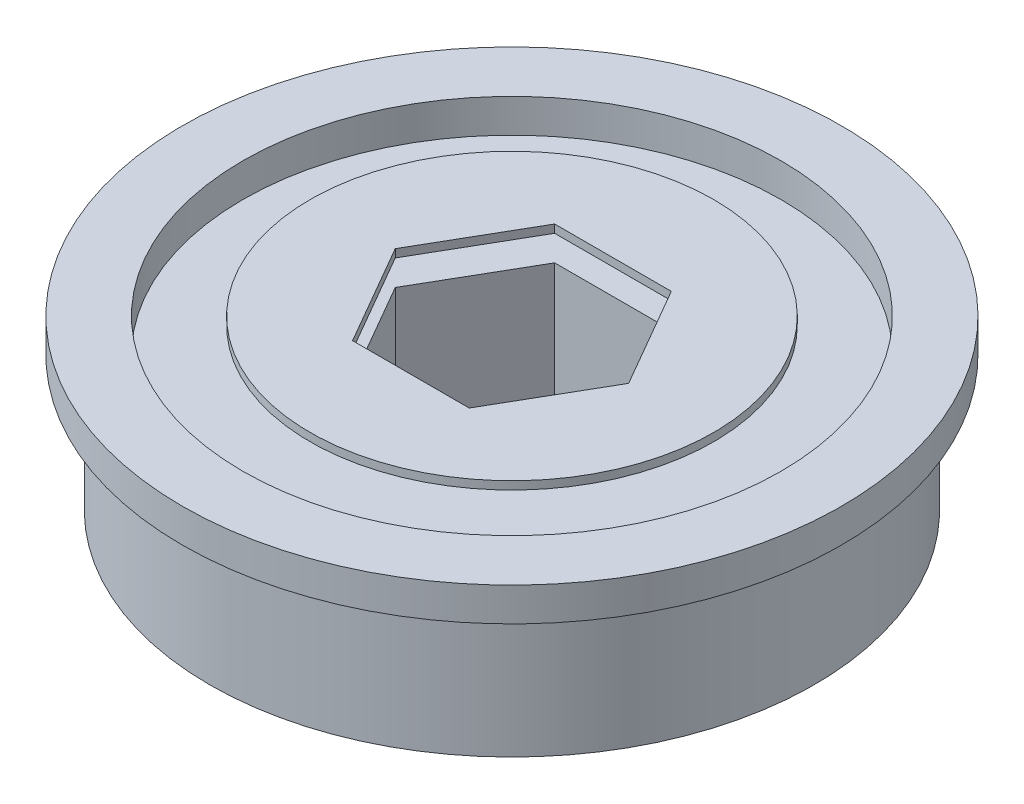
ISO-10303-21;
HEADER;
FILE_DESCRIPTION(('STEP AP214'),'2;1');
FILE_NAME('part.step','',(''),(''),'','','');
FILE_SCHEMA(('AUTOMOTIVE_DESIGN { 1 0 10303 214 1 1 1 1 }'));
ENDSEC;
DATA;
#1=APPLICATION_CONTEXT('core data for automotive mechanical design processes');
#2=APPLICATION_PROTOCOL_DEFINITION('international standard','automotive_design',2000,#1);
#3=PRODUCT_CONTEXT('',#1,'mechanical');
#4=PRODUCT('Part','Part','',(#3));
#5=PRODUCT_RELATED_PRODUCT_CATEGORY('part','',(#4));
#6=PRODUCT_DEFINITION_FORMATION('','',#4);
#7=PRODUCT_DEFINITION_CONTEXT('part definition',#1,'design');
#8=PRODUCT_DEFINITION('design','',#6,#7);
#9=PRODUCT_DEFINITION_SHAPE('','',#8);
#10=(LENGTH_UNIT() NAMED_UNIT(*) SI_UNIT(.MILLI.,.METRE.));
#11=(NAMED_UNIT(*) PLANE_ANGLE_UNIT() SI_UNIT($,.RADIAN.));
#12=(NAMED_UNIT(*) SI_UNIT($,.STERADIAN.) SOLID_ANGLE_UNIT());
#13=UNCERTAINTY_MEASURE_WITH_UNIT(LENGTH_MEASURE(1.E-05),#10,'distance_accuracy_value','');
#14=(GEOMETRIC_REPRESENTATION_CONTEXT(3) GLOBAL_UNCERTAINTY_ASSIGNED_CONTEXT((#13)) GLOBAL_UNIT_ASSIGNED_CONTEXT((#10,
#11,#12)) REPRESENTATION_CONTEXT('',''));
#15=CARTESIAN_POINT('',(0.,0.,0.));
#16=DIRECTION('',(0.,0.,1.));
#17=DIRECTION('',(1.,0.,0.));
#18=AXIS2_PLACEMENT_3D('',#15,#16,#17);
#19=CARTESIAN_POINT('',(0.,7.9375,0.));
#20=DIRECTION('',(0.,1.,0.));
#21=DIRECTION('',(0.,0.,1.));
#22=AXIS2_PLACEMENT_3D('',#19,#20,#21);
#23=PLANE('',#22);
#24=CARTESIAN_POINT('',(0.,7.9375,0.));
#25=DIRECTION('',(0.,-1.,0.));
#26=DIRECTION('',(0.,0.,-1.));
#27=AXIS2_PLACEMENT_3D('',#24,#25,#26);
#28=CIRCLE('',#27,9.525);
#29=CARTESIAN_POINT('',(0.,7.9375,-9.525));
#30=VERTEX_POINT('',#29);
#31=EDGE_CURVE('P0_E20',#30,#30,#28,.T.);
#32=ORIENTED_EDGE('',*,*,#31,.F.);
#33=EDGE_LOOP('',(#32));
#34=FACE_BOUND('',#33,.T.);
#35=DIRECTION('',(0.5,0.,-0.866025403784439));
#36=VECTOR('',#35,1.);
#37=CARTESIAN_POINT('',(5.50792156806903,7.9375,0.));
#38=LINE('',#37,#36);
#39=CARTESIAN_POINT('',(5.50792156806903,7.9375,0.));
#40=VERTEX_POINT('',#39);
#41=CARTESIAN_POINT('',(2.75396078403451,7.9375,4.77));
#42=VERTEX_POINT('',#41);
#43=EDGE_CURVE('P0_E91',#40,#42,#38,.F.);
#44=ORIENTED_EDGE('',*,*,#43,.T.);
#45=DIRECTION('',(1.,0.,0.));
#46=VECTOR('',#45,1.);
#47=CARTESIAN_POINT('',(2.75396078403451,7.9375,4.77));
#48=LINE('',#47,#46);
#49=CARTESIAN_POINT('',(-2.75396078403451,7.9375,4.77));
#50=VERTEX_POINT('',#49);
#51=EDGE_CURVE('P0_E96',#42,#50,#48,.F.);
#52=ORIENTED_EDGE('',*,*,#51,.T.);
#53=DIRECTION('',(0.5,0.,0.866025403784439));
#54=VECTOR('',#53,1.);
#55=CARTESIAN_POINT('',(-2.75396078403451,7.9375,4.77));
#56=LINE('',#55,#54);
#57=CARTESIAN_POINT('',(-5.50792156806903,7.9375,0.));
#58=VERTEX_POINT('',#57);
#59=EDGE_CURVE('P0_E101',#50,#58,#56,.F.);
#60=ORIENTED_EDGE('',*,*,#59,.T.);
#61=DIRECTION('',(-0.5,0.,0.866025403784439));
#62=VECTOR('',#61,1.);
#63=CARTESIAN_POINT('',(-5.50792156806903,7.9375,0.));
#64=LINE('',#63,#62);
#65=CARTESIAN_POINT('',(-2.75396078403451,7.9375,-4.77));
#66=VERTEX_POINT('',#65);
#67=EDGE_CURVE('P0_E71',#58,#66,#64,.F.);
#68=ORIENTED_EDGE('',*,*,#67,.T.);
#69=DIRECTION('',(-1.,0.,0.));
#70=VECTOR('',#69,1.);
#71=CARTESIAN_POINT('',(-2.75396078403451,7.9375,-4.77));
#72=LINE('',#71,#70);
#73=CARTESIAN_POINT('',(2.75396078403451,7.9375,-4.77));
#74=VERTEX_POINT('',#73);
#75=EDGE_CURVE('P0_E70',#66,#74,#72,.F.);
#76=ORIENTED_EDGE('',*,*,#75,.T.);
#77=DIRECTION('',(-0.5,0.,-0.866025403784439));
#78=VECTOR('',#77,1.);
#79=CARTESIAN_POINT('',(2.75396078403452,7.9375,-4.77));
#80=LINE('',#79,#78);
#81=EDGE_CURVE('P0_E67',#74,#40,#80,.F.);
#82=ORIENTED_EDGE('',*,*,#81,.T.);
#83=EDGE_LOOP('',(#44,#52,#60,#68,#76,#82));
#84=FACE_BOUND('',#83,.T.);
#85=ADVANCED_FACE('P0_F17',(#34,#84),#23,.T.);
#86=CARTESIAN_POINT('',(-2.75396078403451,7.9375,-4.77));
#87=DIRECTION('',(0.,0.,-1.));
#88=DIRECTION('',(-1.,0.,0.));
#89=AXIS2_PLACEMENT_3D('',#86,#87,#88);
#90=PLANE('',#89);
#91=ORIENTED_EDGE('',*,*,#75,.F.);
#92=DIRECTION('',(0.,1.,0.));
#93=VECTOR('',#92,1.);
#94=CARTESIAN_POINT('',(-2.75396078403451,7.9375,-4.77));
#95=LINE('',#94,#93);
#96=CARTESIAN_POINT('',(-2.75396078403451,7.5565,-4.77));
#97=VERTEX_POINT('',#96);
#98=EDGE_CURVE('P0_E105',#66,#97,#95,.F.);
#99=ORIENTED_EDGE('',*,*,#98,.T.);
#100=DIRECTION('',(1.,0.,0.));
#101=VECTOR('',#100,1.);
#102=CARTESIAN_POINT('',(0.,7.5565,-4.77));
#103=LINE('',#102,#101);
#104=CARTESIAN_POINT('',(2.75396078403451,7.5565,-4.77));
#105=VERTEX_POINT('',#104);
#106=EDGE_CURVE('P0_E87',#97,#105,#103,.T.);
#107=ORIENTED_EDGE('',*,*,#106,.T.);
#108=DIRECTION('',(0.,1.,0.));
#109=VECTOR('',#108,1.);
#110=CARTESIAN_POINT('',(2.75396078403452,7.9375,-4.77));
#111=LINE('',#110,#109);
#112=EDGE_CURVE('P0_E76',#105,#74,#111,.T.);
#113=ORIENTED_EDGE('',*,*,#112,.T.);
#114=EDGE_LOOP('',(#91,#99,#107,#113));
#115=FACE_BOUND('',#114,.T.);
#116=ADVANCED_FACE('P0_F86',(#115),#90,.F.);
#117=CARTESIAN_POINT('',(2.75396078403452,7.9375,-4.77));
#118=DIRECTION('',(0.866025403784439,0.,-0.5));
#119=DIRECTION('',(-0.5,0.,-0.866025403784439));
#120=AXIS2_PLACEMENT_3D('',#117,#118,#119);
#121=PLANE('',#120);
#122=ORIENTED_EDGE('',*,*,#81,.F.);
#123=ORIENTED_EDGE('',*,*,#112,.F.);
#124=DIRECTION('',(0.5,0.,0.866025403784439));
#125=VECTOR('',#124,1.);
#126=CARTESIAN_POINT('',(2.75396078403452,7.5565,-4.77));
#127=LINE('',#126,#125);
#128=CARTESIAN_POINT('',(5.50792156806903,7.5565,0.));
#129=VERTEX_POINT('',#128);
#130=EDGE_CURVE('P0_E108',#105,#129,#127,.T.);
#131=ORIENTED_EDGE('',*,*,#130,.T.);
#132=DIRECTION('',(0.,1.,0.));
#133=VECTOR('',#132,1.);
#134=CARTESIAN_POINT('',(5.50792156806903,7.9375,0.));
#135=LINE('',#134,#133);
#136=EDGE_CURVE('P0_E83',#129,#40,#135,.T.);
#137=ORIENTED_EDGE('',*,*,#136,.T.);
#138=EDGE_LOOP('',(#122,#123,#131,#137));
#139=FACE_BOUND('',#138,.T.);
#140=ADVANCED_FACE('P0_F80',(#139),#121,.F.);
#141=CARTESIAN_POINT('',(5.50792156806903,7.9375,0.));
#142=DIRECTION('',(0.866025403784439,0.,0.5));
#143=DIRECTION('',(0.5,0.,-0.866025403784439));
#144=AXIS2_PLACEMENT_3D('',#141,#142,#143);
#145=PLANE('',#144);
#146=ORIENTED_EDGE('',*,*,#43,.F.);
#147=ORIENTED_EDGE('',*,*,#136,.F.);
#148=DIRECTION('',(-0.5,0.,0.866025403784439));
#149=VECTOR('',#148,1.);
#150=CARTESIAN_POINT('',(5.50792156806903,7.5565,0.));
#151=LINE('',#150,#149);
#152=CARTESIAN_POINT('',(2.75396078403451,7.5565,4.77));
#153=VERTEX_POINT('',#152);
#154=EDGE_CURVE('P0_E110',#129,#153,#151,.T.);
#155=ORIENTED_EDGE('',*,*,#154,.T.);
#156=DIRECTION('',(0.,1.,0.));
#157=VECTOR('',#156,1.);
#158=CARTESIAN_POINT('',(2.75396078403451,7.9375,4.77));
#159=LINE('',#158,#157);
#160=EDGE_CURVE('P0_E93',#153,#42,#159,.T.);
#161=ORIENTED_EDGE('',*,*,#160,.T.);
#162=EDGE_LOOP('',(#146,#147,#155,#161));
#163=FACE_BOUND('',#162,.T.);
#164=ADVANCED_FACE('P0_F132',(#163),#145,.F.);
#165=CARTESIAN_POINT('',(2.75396078403451,7.9375,4.77));
#166=DIRECTION('',(0.,0.,1.));
#167=DIRECTION('',(1.,0.,0.));
#168=AXIS2_PLACEMENT_3D('',#165,#166,#167);
#169=PLANE('',#168);
#170=ORIENTED_EDGE('',*,*,#51,.F.);
#171=ORIENTED_EDGE('',*,*,#160,.F.);
#172=DIRECTION('',(1.,0.,0.));
#173=VECTOR('',#172,1.);
#174=CARTESIAN_POINT('',(0.,7.5565,4.77));
#175=LINE('',#174,#173);
#176=CARTESIAN_POINT('',(-2.75396078403451,7.5565,4.77));
#177=VERTEX_POINT('',#176);
#178=EDGE_CURVE('P0_E113',#153,#177,#175,.F.);
#179=ORIENTED_EDGE('',*,*,#178,.T.);
#180=DIRECTION('',(0.,1.,0.));
#181=VECTOR('',#180,1.);
#182=CARTESIAN_POINT('',(-2.75396078403451,7.9375,4.77));
#183=LINE('',#182,#181);
#184=EDGE_CURVE('P0_E98',#177,#50,#183,.T.);
#185=ORIENTED_EDGE('',*,*,#184,.T.);
#186=EDGE_LOOP('',(#170,#171,#179,#185));
#187=FACE_BOUND('',#186,.T.);
#188=ADVANCED_FACE('P0_F129',(#187),#169,.F.);
#189=CARTESIAN_POINT('',(-2.75396078403451,7.9375,4.77));
#190=DIRECTION('',(-0.866025403784439,0.,0.5));
#191=DIRECTION('',(0.5,0.,0.866025403784439));
#192=AXIS2_PLACEMENT_3D('',#189,#190,#191);
#193=PLANE('',#192);
#194=ORIENTED_EDGE('',*,*,#59,.F.);
#195=ORIENTED_EDGE('',*,*,#184,.F.);
#196=DIRECTION('',(-0.5,0.,-0.866025403784439));
#197=VECTOR('',#196,1.);
#198=CARTESIAN_POINT('',(-2.75396078403451,7.5565,4.77));
#199=LINE('',#198,#197);
#200=CARTESIAN_POINT('',(-5.50792156806903,7.5565,0.));
#201=VERTEX_POINT('',#200);
#202=EDGE_CURVE('P0_E116',#177,#201,#199,.T.);
#203=ORIENTED_EDGE('',*,*,#202,.T.);
#204=DIRECTION('',(0.,1.,0.));
#205=VECTOR('',#204,1.);
#206=CARTESIAN_POINT('',(-5.50792156806903,7.9375,0.));
#207=LINE('',#206,#205);
#208=EDGE_CURVE('P0_E34',#201,#58,#207,.T.);
#209=ORIENTED_EDGE('',*,*,#208,.T.);
#210=EDGE_LOOP('',(#194,#195,#203,#209));
#211=FACE_BOUND('',#210,.T.);
#212=ADVANCED_FACE('P0_F126',(#211),#193,.F.);
#213=CARTESIAN_POINT('',(-5.50792156806903,7.9375,0.));
#214=DIRECTION('',(-0.866025403784439,0.,-0.5));
#215=DIRECTION('',(-0.5,0.,0.866025403784439));
#216=AXIS2_PLACEMENT_3D('',#213,#214,#215);
#217=PLANE('',#216);
#218=ORIENTED_EDGE('',*,*,#67,.F.);
#219=ORIENTED_EDGE('',*,*,#208,.F.);
#220=DIRECTION('',(0.500000000000001,0.,-0.866025403784438));
#221=VECTOR('',#220,1.);
#222=CARTESIAN_POINT('',(-5.50792156806903,7.5565,0.));
#223=LINE('',#222,#221);
#224=EDGE_CURVE('P0_E26',#201,#97,#223,.T.);
#225=ORIENTED_EDGE('',*,*,#224,.T.);
#226=ORIENTED_EDGE('',*,*,#98,.F.);
#227=EDGE_LOOP('',(#218,#219,#225,#226));
#228=FACE_BOUND('',#227,.T.);
#229=ADVANCED_FACE('P0_F119',(#228),#217,.F.);
#230=CARTESIAN_POINT('',(0.,7.9375,0.));
#231=DIRECTION('',(0.,-1.,0.));
#232=DIRECTION('',(0.,0.,-1.));
#233=AXIS2_PLACEMENT_3D('',#230,#231,#232);
#234=CYLINDRICAL_SURFACE('',#233,9.525);
#235=CARTESIAN_POINT('',(0.,7.5565,0.));
#236=DIRECTION('',(0.,-1.,0.));
#237=DIRECTION('',(0.,0.,-1.));
#238=AXIS2_PLACEMENT_3D('',#235,#236,#237);
#239=CIRCLE('',#238,9.525);
#240=CARTESIAN_POINT('',(0.,7.5565,-9.525));
#241=VERTEX_POINT('',#240);
#242=EDGE_CURVE('P0_E11',#241,#241,#239,.F.);
#243=ORIENTED_EDGE('',*,*,#242,.T.);
#244=EDGE_LOOP('',(#243));
#245=FACE_BOUND('',#244,.T.);
#246=ORIENTED_EDGE('',*,*,#31,.T.);
#247=EDGE_LOOP('',(#246));
#248=FACE_BOUND('',#247,.T.);
#249=ADVANCED_FACE('P0_F143',(#245,#248),#234,.T.);
#250=CARTESIAN_POINT('',(0.,7.5565,0.));
#251=DIRECTION('',(0.,1.,0.));
#252=DIRECTION('',(0.,0.,1.));
#253=AXIS2_PLACEMENT_3D('',#250,#251,#252);
#254=PLANE('',#253);
#255=ORIENTED_EDGE('',*,*,#242,.F.);
#256=EDGE_LOOP('',(#255));
#257=FACE_BOUND('',#256,.T.);
#258=ORIENTED_EDGE('',*,*,#202,.F.);
#259=ORIENTED_EDGE('',*,*,#178,.F.);
#260=ORIENTED_EDGE('',*,*,#154,.F.);
#261=ORIENTED_EDGE('',*,*,#130,.F.);
#262=ORIENTED_EDGE('',*,*,#106,.F.);
#263=ORIENTED_EDGE('',*,*,#224,.F.);
#264=EDGE_LOOP('',(#258,#259,#260,#261,#262,#263));
#265=FACE_BOUND('',#264,.T.);
#266=ADVANCED_FACE('P0_F122',(#257,#265),#254,.F.);
#267=CLOSED_SHELL('',(#85,#116,#140,#164,#188,#212,#229,#249,#266));
#268=MANIFOLD_SOLID_BREP('P0_B1',#267);
#269=CARTESIAN_POINT('',(0.,7.9375,0.));
#270=DIRECTION('',(0.,1.,0.));
#271=DIRECTION('',(0.,0.,1.));
#272=AXIS2_PLACEMENT_3D('',#269,#270,#271);
#273=PLANE('',#272);
#274=CARTESIAN_POINT('',(0.,7.9375,0.));
#275=DIRECTION('',(0.,1.,0.));
#276=DIRECTION('',(0.,0.,1.));
#277=AXIS2_PLACEMENT_3D('',#274,#275,#276);
#278=CIRCLE('',#277,15.5575);
#279=CARTESIAN_POINT('',(0.,7.9375,15.5575));
#280=VERTEX_POINT('',#279);
#281=EDGE_CURVE('P1_E105',#280,#280,#278,.F.);
#282=ORIENTED_EDGE('',*,*,#281,.F.);
#283=EDGE_LOOP('',(#282));
#284=FACE_BOUND('',#283,.T.);
#285=CARTESIAN_POINT('',(0.,7.9375,0.));
#286=DIRECTION('',(0.,1.,0.));
#287=DIRECTION('',(0.,0.,1.));
#288=AXIS2_PLACEMENT_3D('',#285,#286,#287);
#289=CIRCLE('',#288,12.7);
#290=CARTESIAN_POINT('',(0.,7.9375,12.7));
#291=VERTEX_POINT('',#290);
#292=EDGE_CURVE('P1_E20',#291,#291,#289,.F.);
#293=ORIENTED_EDGE('',*,*,#292,.T.);
#294=EDGE_LOOP('',(#293));
#295=FACE_BOUND('',#294,.T.);
#296=ADVANCED_FACE('P1_F17',(#284,#295),#273,.T.);
#297=CARTESIAN_POINT('',(0.,7.9375,0.));
#298=DIRECTION('',(0.,1.,0.));
#299=DIRECTION('',(0.,0.,1.));
#300=AXIS2_PLACEMENT_3D('',#297,#298,#299);
#301=CYLINDRICAL_SURFACE('',#300,12.7);
#302=CARTESIAN_POINT('',(0.,6.34999999999999,0.));
#303=DIRECTION('',(0.,1.,0.));
#304=DIRECTION('',(0.,0.,1.));
#305=AXIS2_PLACEMENT_3D('',#302,#303,#304);
#306=CIRCLE('',#305,12.7);
#307=CARTESIAN_POINT('',(0.,6.34999999999999,12.7));
#308=VERTEX_POINT('',#307);
#309=EDGE_CURVE('P1_E103',#308,#308,#306,.F.);
#310=ORIENTED_EDGE('',*,*,#309,.T.);
#311=EDGE_LOOP('',(#310));
#312=FACE_BOUND('',#311,.T.);
#313=ORIENTED_EDGE('',*,*,#292,.F.);
#314=EDGE_LOOP('',(#313));
#315=FACE_BOUND('',#314,.T.);
#316=ADVANCED_FACE('P1_F113',(#312,#315),#301,.F.);
#317=CARTESIAN_POINT('',(0.,6.35,0.));
#318=DIRECTION('',(0.,1.,0.));
#319=DIRECTION('',(0.,0.,1.));
#320=AXIS2_PLACEMENT_3D('',#317,#318,#319);
#321=CYLINDRICAL_SURFACE('',#320,15.5575);
#322=CARTESIAN_POINT('',(0.,6.35,0.));
#323=DIRECTION('',(0.,1.,0.));
#324=DIRECTION('',(0.,0.,1.));
#325=AXIS2_PLACEMENT_3D('',#322,#323,#324);
#326=CIRCLE('',#325,15.5575);
#327=CARTESIAN_POINT('',(0.,6.35,15.5575));
#328=VERTEX_POINT('',#327);
#329=EDGE_CURVE('P1_E86',#328,#328,#326,.F.);
#330=ORIENTED_EDGE('',*,*,#329,.F.);
#331=EDGE_LOOP('',(#330));
#332=FACE_BOUND('',#331,.T.);
#333=ORIENTED_EDGE('',*,*,#281,.T.);
#334=EDGE_LOOP('',(#333));
#335=FACE_BOUND('',#334,.T.);
#336=ADVANCED_FACE('P1_F115',(#332,#335),#321,.T.);
#337=CARTESIAN_POINT('',(0.,6.35,0.));
#338=DIRECTION('',(0.,-1.,0.));
#339=DIRECTION('',(0.,0.,-1.));
#340=AXIS2_PLACEMENT_3D('',#337,#338,#339);
#341=PLANE('',#340);
#342=ORIENTED_EDGE('',*,*,#309,.F.);
#343=EDGE_LOOP('',(#342));
#344=FACE_BOUND('',#343,.T.);
#345=DIRECTION('',(0.5,0.,0.866025403784439));
#346=VECTOR('',#345,1.);
#347=CARTESIAN_POINT('',(-2.75396078403451,6.35,4.77));
#348=LINE('',#347,#346);
#349=CARTESIAN_POINT('',(-2.75396078403451,6.35,4.77));
#350=VERTEX_POINT('',#349);
#351=CARTESIAN_POINT('',(-5.50792156806903,6.35,0.));
#352=VERTEX_POINT('',#351);
#353=EDGE_CURVE('P1_E73',#350,#352,#348,.F.);
#354=ORIENTED_EDGE('',*,*,#353,.T.);
#355=DIRECTION('',(-0.5,0.,0.866025403784439));
#356=VECTOR('',#355,1.);
#357=CARTESIAN_POINT('',(-5.50792156806903,6.35,0.));
#358=LINE('',#357,#356);
#359=CARTESIAN_POINT('',(-2.75396078403451,6.35,-4.77));
#360=VERTEX_POINT('',#359);
#361=EDGE_CURVE('P1_E266',#352,#360,#358,.F.);
#362=ORIENTED_EDGE('',*,*,#361,.T.);
#363=DIRECTION('',(-1.,0.,0.));
#364=VECTOR('',#363,1.);
#365=CARTESIAN_POINT('',(-2.75396078403451,6.35,-4.77));
#366=LINE('',#365,#364);
#367=CARTESIAN_POINT('',(2.75396078403451,6.35,-4.77));
#368=VERTEX_POINT('',#367);
#369=EDGE_CURVE('P1_E270',#360,#368,#366,.F.);
#370=ORIENTED_EDGE('',*,*,#369,.T.);
#371=DIRECTION('',(-0.5,0.,-0.866025403784439));
#372=VECTOR('',#371,1.);
#373=CARTESIAN_POINT('',(2.75396078403452,6.35,-4.77));
#374=LINE('',#373,#372);
#375=CARTESIAN_POINT('',(5.50792156806903,6.35,0.));
#376=VERTEX_POINT('',#375);
#377=EDGE_CURVE('P1_E273',#368,#376,#374,.F.);
#378=ORIENTED_EDGE('',*,*,#377,.T.);
#379=DIRECTION('',(0.5,0.,-0.866025403784439));
#380=VECTOR('',#379,1.);
#381=CARTESIAN_POINT('',(5.50792156806903,6.35,0.));
#382=LINE('',#381,#380);
#383=CARTESIAN_POINT('',(2.75396078403451,6.35,4.77));
#384=VERTEX_POINT('',#383);
#385=EDGE_CURVE('P1_E68',#376,#384,#382,.F.);
#386=ORIENTED_EDGE('',*,*,#385,.T.);
#387=DIRECTION('',(1.,0.,0.));
#388=VECTOR('',#387,1.);
#389=CARTESIAN_POINT('',(2.75396078403451,6.35,4.77));
#390=LINE('',#389,#388);
#391=EDGE_CURVE('P1_E70',#384,#350,#390,.F.);
#392=ORIENTED_EDGE('',*,*,#391,.T.);
#393=EDGE_LOOP('',(#354,#362,#370,#378,#386,#392));
#394=FACE_BOUND('',#393,.T.);
#395=ADVANCED_FACE('P1_F72',(#344,#394),#341,.F.);
#396=CARTESIAN_POINT('',(15.5575,6.35,0.));
#397=DIRECTION('',(0.,-1.,0.));
#398=DIRECTION('',(0.,0.,-1.));
#399=AXIS2_PLACEMENT_3D('',#396,#397,#398);
#400=PLANE('',#399);
#401=ORIENTED_EDGE('',*,*,#329,.T.);
#402=EDGE_LOOP('',(#401));
#403=FACE_BOUND('',#402,.T.);
#404=CARTESIAN_POINT('',(0.,6.35,0.));
#405=DIRECTION('',(0.,1.,0.));
#406=DIRECTION('',(0.,0.,1.));
#407=AXIS2_PLACEMENT_3D('',#404,#405,#406);
#408=CIRCLE('',#407,14.2748);
#409=CARTESIAN_POINT('',(0.,6.35,14.2748));
#410=VERTEX_POINT('',#409);
#411=EDGE_CURVE('P1_E97',#410,#410,#408,.F.);
#412=ORIENTED_EDGE('',*,*,#411,.F.);
#413=EDGE_LOOP('',(#412));
#414=FACE_BOUND('',#413,.T.);
#415=ADVANCED_FACE('P1_F156',(#403,#414),#400,.T.);
#416=CARTESIAN_POINT('',(-2.75396078403451,7.9375,4.77));
#417=DIRECTION('',(-0.866025403784439,0.,0.5));
#418=DIRECTION('',(0.5,0.,0.866025403784439));
#419=AXIS2_PLACEMENT_3D('',#416,#417,#418);
#420=PLANE('',#419);
#421=DIRECTION('',(0.5,0.,0.866025403784439));
#422=VECTOR('',#421,1.);
#423=CARTESIAN_POINT('',(-5.50792156806903,0.,0.));
#424=LINE('',#423,#422);
#425=CARTESIAN_POINT('',(-5.50792156806903,0.,0.));
#426=VERTEX_POINT('',#425);
#427=CARTESIAN_POINT('',(-2.75396078403451,0.,4.77));
#428=VERTEX_POINT('',#427);
#429=EDGE_CURVE('P1_E100',#426,#428,#424,.T.);
#430=ORIENTED_EDGE('',*,*,#429,.F.);
#431=DIRECTION('',(0.,1.,0.));
#432=VECTOR('',#431,1.);
#433=CARTESIAN_POINT('',(-5.50792156806903,7.9375,0.));
#434=LINE('',#433,#432);
#435=EDGE_CURVE('P1_E84',#426,#352,#434,.T.);
#436=ORIENTED_EDGE('',*,*,#435,.T.);
#437=ORIENTED_EDGE('',*,*,#353,.F.);
#438=DIRECTION('',(0.,1.,0.));
#439=VECTOR('',#438,1.);
#440=CARTESIAN_POINT('',(-2.75396078403451,7.9375,4.77));
#441=LINE('',#440,#439);
#442=EDGE_CURVE('P1_E78',#350,#428,#441,.F.);
#443=ORIENTED_EDGE('',*,*,#442,.T.);
#444=EDGE_LOOP('',(#430,#436,#437,#443));
#445=FACE_BOUND('',#444,.T.);
#446=ADVANCED_FACE('P1_F81',(#445),#420,.F.);
#447=CARTESIAN_POINT('',(2.75396078403451,7.9375,4.77));
#448=DIRECTION('',(0.,0.,1.));
#449=DIRECTION('',(1.,0.,0.));
#450=AXIS2_PLACEMENT_3D('',#447,#448,#449);
#451=PLANE('',#450);
#452=DIRECTION('',(1.,0.,0.));
#453=VECTOR('',#452,1.);
#454=CARTESIAN_POINT('',(0.,0.,4.77));
#455=LINE('',#454,#453);
#456=CARTESIAN_POINT('',(2.75396078403451,0.,4.77));
#457=VERTEX_POINT('',#456);
#458=EDGE_CURVE('P1_E90',#428,#457,#455,.T.);
#459=ORIENTED_EDGE('',*,*,#458,.F.);
#460=ORIENTED_EDGE('',*,*,#442,.F.);
#461=ORIENTED_EDGE('',*,*,#391,.F.);
#462=DIRECTION('',(0.,1.,0.));
#463=VECTOR('',#462,1.);
#464=CARTESIAN_POINT('',(2.75396078403451,7.9375,4.77));
#465=LINE('',#464,#463);
#466=EDGE_CURVE('P1_E93',#384,#457,#465,.F.);
#467=ORIENTED_EDGE('',*,*,#466,.T.);
#468=EDGE_LOOP('',(#459,#460,#461,#467));
#469=FACE_BOUND('',#468,.T.);
#470=ADVANCED_FACE('P1_F88',(#469),#451,.F.);
#471=CARTESIAN_POINT('',(5.50792156806903,7.9375,0.));
#472=DIRECTION('',(0.866025403784439,0.,0.5));
#473=DIRECTION('',(0.5,0.,-0.866025403784439));
#474=AXIS2_PLACEMENT_3D('',#471,#472,#473);
#475=PLANE('',#474);
#476=DIRECTION('',(0.5,0.,-0.866025403784439));
#477=VECTOR('',#476,1.);
#478=CARTESIAN_POINT('',(2.75396078403451,0.,4.77));
#479=LINE('',#478,#477);
#480=CARTESIAN_POINT('',(5.50792156806903,0.,0.));
#481=VERTEX_POINT('',#480);
#482=EDGE_CURVE('P1_E251',#457,#481,#479,.T.);
#483=ORIENTED_EDGE('',*,*,#482,.F.);
#484=ORIENTED_EDGE('',*,*,#466,.F.);
#485=ORIENTED_EDGE('',*,*,#385,.F.);
#486=DIRECTION('',(0.,1.,0.));
#487=VECTOR('',#486,1.);
#488=CARTESIAN_POINT('',(5.50792156806903,7.9375,0.));
#489=LINE('',#488,#487);
#490=EDGE_CURVE('P1_E253',#376,#481,#489,.F.);
#491=ORIENTED_EDGE('',*,*,#490,.T.);
#492=EDGE_LOOP('',(#483,#484,#485,#491));
#493=FACE_BOUND('',#492,.T.);
#494=ADVANCED_FACE('P1_F147',(#493),#475,.F.);
#495=CARTESIAN_POINT('',(2.75396078403452,7.9375,-4.77));
#496=DIRECTION('',(0.866025403784439,0.,-0.5));
#497=DIRECTION('',(-0.5,0.,-0.866025403784439));
#498=AXIS2_PLACEMENT_3D('',#495,#496,#497);
#499=PLANE('',#498);
#500=DIRECTION('',(-0.5,0.,-0.866025403784439));
#501=VECTOR('',#500,1.);
#502=CARTESIAN_POINT('',(5.50792156806903,0.,0.));
#503=LINE('',#502,#501);
#504=CARTESIAN_POINT('',(2.75396078403451,0.,-4.77));
#505=VERTEX_POINT('',#504);
#506=EDGE_CURVE('P1_E256',#481,#505,#503,.T.);
#507=ORIENTED_EDGE('',*,*,#506,.F.);
#508=ORIENTED_EDGE('',*,*,#490,.F.);
#509=ORIENTED_EDGE('',*,*,#377,.F.);
#510=DIRECTION('',(0.,1.,0.));
#511=VECTOR('',#510,1.);
#512=CARTESIAN_POINT('',(2.75396078403452,7.9375,-4.77));
#513=LINE('',#512,#511);
#514=EDGE_CURVE('P1_E268',#368,#505,#513,.F.);
#515=ORIENTED_EDGE('',*,*,#514,.T.);
#516=EDGE_LOOP('',(#507,#508,#509,#515));
#517=FACE_BOUND('',#516,.T.);
#518=ADVANCED_FACE('P1_F144',(#517),#499,.F.);
#519=CARTESIAN_POINT('',(-2.75396078403451,7.9375,-4.77));
#520=DIRECTION('',(0.,0.,-1.));
#521=DIRECTION('',(-1.,0.,0.));
#522=AXIS2_PLACEMENT_3D('',#519,#520,#521);
#523=PLANE('',#522);
#524=DIRECTION('',(1.,0.,0.));
#525=VECTOR('',#524,1.);
#526=CARTESIAN_POINT('',(0.,0.,-4.77));
#527=LINE('',#526,#525);
#528=CARTESIAN_POINT('',(-2.75396078403451,0.,-4.77));
#529=VERTEX_POINT('',#528);
#530=EDGE_CURVE('P1_E276',#505,#529,#527,.F.);
#531=ORIENTED_EDGE('',*,*,#530,.F.);
#532=ORIENTED_EDGE('',*,*,#514,.F.);
#533=ORIENTED_EDGE('',*,*,#369,.F.);
#534=DIRECTION('',(0.,1.,0.));
#535=VECTOR('',#534,1.);
#536=CARTESIAN_POINT('',(-2.75396078403451,7.9375,-4.77));
#537=LINE('',#536,#535);
#538=EDGE_CURVE('P1_E35',#360,#529,#537,.F.);
#539=ORIENTED_EDGE('',*,*,#538,.T.);
#540=EDGE_LOOP('',(#531,#532,#533,#539));
#541=FACE_BOUND('',#540,.T.);
#542=ADVANCED_FACE('P1_F140',(#541),#523,.F.);
#543=CARTESIAN_POINT('',(-5.50792156806903,7.9375,0.));
#544=DIRECTION('',(-0.866025403784439,0.,-0.5));
#545=DIRECTION('',(-0.5,0.,0.866025403784439));
#546=AXIS2_PLACEMENT_3D('',#543,#544,#545);
#547=PLANE('',#546);
#548=DIRECTION('',(-0.500000000000001,0.,0.866025403784438));
#549=VECTOR('',#548,1.);
#550=CARTESIAN_POINT('',(-2.75396078403451,0.,-4.77));
#551=LINE('',#550,#549);
#552=EDGE_CURVE('P1_E26',#529,#426,#551,.T.);
#553=ORIENTED_EDGE('',*,*,#552,.F.);
#554=ORIENTED_EDGE('',*,*,#538,.F.);
#555=ORIENTED_EDGE('',*,*,#361,.F.);
#556=ORIENTED_EDGE('',*,*,#435,.F.);
#557=EDGE_LOOP('',(#553,#554,#555,#556));
#558=FACE_BOUND('',#557,.T.);
#559=ADVANCED_FACE('P1_F133',(#558),#547,.F.);
#560=CARTESIAN_POINT('',(0.,0.,0.));
#561=DIRECTION('',(0.,1.,0.));
#562=DIRECTION('',(0.,0.,1.));
#563=AXIS2_PLACEMENT_3D('',#560,#561,#562);
#564=CYLINDRICAL_SURFACE('',#563,14.2748);
#565=ORIENTED_EDGE('',*,*,#411,.T.);
#566=EDGE_LOOP('',(#565));
#567=FACE_BOUND('',#566,.T.);
#568=CARTESIAN_POINT('',(0.,0.,0.));
#569=DIRECTION('',(0.,1.,0.));
#570=DIRECTION('',(0.,0.,1.));
#571=AXIS2_PLACEMENT_3D('',#568,#569,#570);
#572=CIRCLE('',#571,14.2748);
#573=CARTESIAN_POINT('',(0.,0.,14.2748));
#574=VERTEX_POINT('',#573);
#575=EDGE_CURVE('P1_E11',#574,#574,#572,.F.);
#576=ORIENTED_EDGE('',*,*,#575,.F.);
#577=EDGE_LOOP('',(#576));
#578=FACE_BOUND('',#577,.T.);
#579=ADVANCED_FACE('P1_F127',(#567,#578),#564,.T.);
#580=CARTESIAN_POINT('',(0.,0.,0.));
#581=DIRECTION('',(0.,-1.,0.));
#582=DIRECTION('',(0.,0.,-1.));
#583=AXIS2_PLACEMENT_3D('',#580,#581,#582);
#584=PLANE('',#583);
#585=ORIENTED_EDGE('',*,*,#575,.T.);
#586=EDGE_LOOP('',(#585));
#587=FACE_BOUND('',#586,.T.);
#588=ORIENTED_EDGE('',*,*,#530,.T.);
#589=ORIENTED_EDGE('',*,*,#552,.T.);
#590=ORIENTED_EDGE('',*,*,#429,.T.);
#591=ORIENTED_EDGE('',*,*,#458,.T.);
#592=ORIENTED_EDGE('',*,*,#482,.T.);
#593=ORIENTED_EDGE('',*,*,#506,.T.);
#594=EDGE_LOOP('',(#588,#589,#590,#591,#592,#593));
#595=FACE_BOUND('',#594,.T.);
#596=ADVANCED_FACE('P1_F125',(#587,#595),#584,.T.);
#597=CLOSED_SHELL('',(#296,#316,#336,#395,#415,#446,#470,#494,#518,#542,#559,#579,#596));
#598=MANIFOLD_SOLID_BREP('P1_B1',#597);
#599=ADVANCED_BREP_SHAPE_REPRESENTATION('',(#18,#268,#598),#14);
#600=SHAPE_DEFINITION_REPRESENTATION(#9,#599);
ENDSEC;
END-ISO-10303-21;
